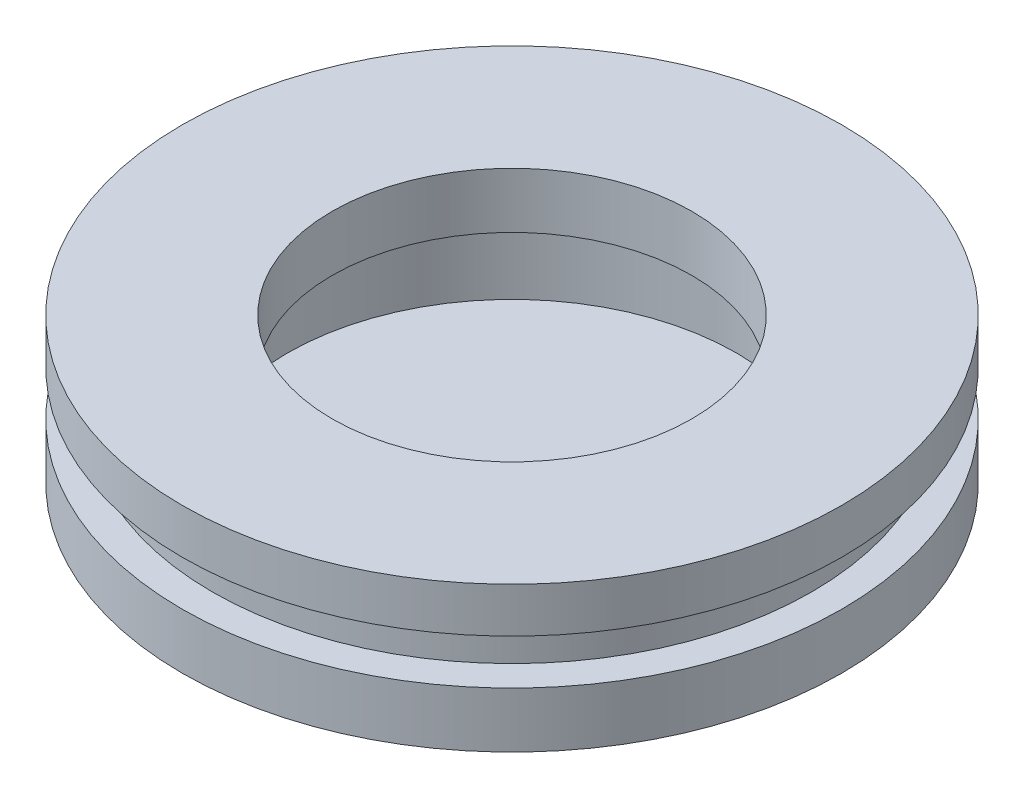
ISO-10303-21;
HEADER;
FILE_DESCRIPTION(('STEP AP214'),'2;1');
FILE_NAME('part.step','',(''),(''),'','','');
FILE_SCHEMA(('AUTOMOTIVE_DESIGN { 1 0 10303 214 1 1 1 1 }'));
ENDSEC;
DATA;
#1=APPLICATION_CONTEXT('core data for automotive mechanical design processes');
#2=APPLICATION_PROTOCOL_DEFINITION('international standard','automotive_design',2000,#1);
#3=PRODUCT_CONTEXT('',#1,'mechanical');
#4=PRODUCT('Part','Part','',(#3));
#5=PRODUCT_RELATED_PRODUCT_CATEGORY('part','',(#4));
#6=PRODUCT_DEFINITION_FORMATION('','',#4);
#7=PRODUCT_DEFINITION_CONTEXT('part definition',#1,'design');
#8=PRODUCT_DEFINITION('design','',#6,#7);
#9=PRODUCT_DEFINITION_SHAPE('','',#8);
#10=(LENGTH_UNIT() NAMED_UNIT(*) SI_UNIT(.MILLI.,.METRE.));
#11=(NAMED_UNIT(*) PLANE_ANGLE_UNIT() SI_UNIT($,.RADIAN.));
#12=(NAMED_UNIT(*) SI_UNIT($,.STERADIAN.) SOLID_ANGLE_UNIT());
#13=UNCERTAINTY_MEASURE_WITH_UNIT(LENGTH_MEASURE(1.E-05),#10,'distance_accuracy_value','');
#14=(GEOMETRIC_REPRESENTATION_CONTEXT(3) GLOBAL_UNCERTAINTY_ASSIGNED_CONTEXT((#13)) GLOBAL_UNIT_ASSIGNED_CONTEXT((#10,
#11,#12)) REPRESENTATION_CONTEXT('',''));
#15=CARTESIAN_POINT('',(0.,0.,0.));
#16=DIRECTION('',(0.,0.,1.));
#17=DIRECTION('',(1.,0.,0.));
#18=AXIS2_PLACEMENT_3D('',#15,#16,#17);
#19=CARTESIAN_POINT('',(0.,4.00367257692815,0.));
#20=DIRECTION('',(0.,1.,0.));
#21=DIRECTION('',(0.,0.,1.));
#22=AXIS2_PLACEMENT_3D('',#19,#20,#21);
#23=CONICAL_SURFACE('',#22,11.,1.22173047639604);
#24=CARTESIAN_POINT('',(0.,0.,0.));
#25=VERTEX_POINT('',#24);
#26=VERTEX_LOOP('',#25);
#27=FACE_BOUND('',#26,.T.);
#28=CARTESIAN_POINT('',(0.,4.00367257692815,0.));
#29=DIRECTION('',(0.,-1.,0.));
#30=DIRECTION('',(0.,0.,-1.));
#31=AXIS2_PLACEMENT_3D('',#28,#29,#30);
#32=CIRCLE('',#31,11.);
#33=CARTESIAN_POINT('',(0.,4.00367257692815,-11.));
#34=VERTEX_POINT('',#33);
#35=EDGE_CURVE('E47',#34,#34,#32,.T.);
#36=ORIENTED_EDGE('',*,*,#35,.T.);
#37=EDGE_LOOP('',(#36));
#38=FACE_BOUND('',#37,.T.);
#39=ADVANCED_FACE('F32',(#27,#38),#23,.T.);
#40=CARTESIAN_POINT('',(0.,8.85367257692815,0.));
#41=DIRECTION('',(0.,-1.,0.));
#42=DIRECTION('',(0.,0.,-1.));
#43=AXIS2_PLACEMENT_3D('',#40,#41,#42);
#44=PLANE('',#43);
#45=CARTESIAN_POINT('',(0.,8.85367257692815,0.));
#46=DIRECTION('',(0.,-1.,0.));
#47=DIRECTION('',(0.,0.,-1.));
#48=AXIS2_PLACEMENT_3D('',#45,#46,#47);
#49=CIRCLE('',#48,6.);
#50=CARTESIAN_POINT('',(0.,8.85367257692815,-6.));
#51=VERTEX_POINT('',#50);
#52=EDGE_CURVE('E35',#51,#51,#49,.F.);
#53=ORIENTED_EDGE('',*,*,#52,.F.);
#54=EDGE_LOOP('',(#53));
#55=FACE_BOUND('',#54,.T.);
#56=CARTESIAN_POINT('',(0.,8.85367257692815,0.));
#57=DIRECTION('',(0.,-1.,0.));
#58=DIRECTION('',(0.,0.,-1.));
#59=AXIS2_PLACEMENT_3D('',#56,#57,#58);
#60=CIRCLE('',#59,11.);
#61=CARTESIAN_POINT('',(0.,8.85367257692815,-11.));
#62=VERTEX_POINT('',#61);
#63=EDGE_CURVE('E11',#62,#62,#60,.T.);
#64=ORIENTED_EDGE('',*,*,#63,.F.);
#65=EDGE_LOOP('',(#64));
#66=FACE_BOUND('',#65,.T.);
#67=ADVANCED_FACE('F44',(#55,#66),#44,.F.);
#68=CARTESIAN_POINT('',(0.,0.,0.));
#69=DIRECTION('',(0.,-1.,0.));
#70=DIRECTION('',(0.,0.,-1.));
#71=AXIS2_PLACEMENT_3D('',#68,#69,#70);
#72=CYLINDRICAL_SURFACE('',#71,11.);
#73=CARTESIAN_POINT('',(0.,7.35367257692815,0.));
#74=DIRECTION('',(0.,-1.,0.));
#75=DIRECTION('',(0.,0.,-1.));
#76=AXIS2_PLACEMENT_3D('',#73,#74,#75);
#77=CIRCLE('',#76,11.);
#78=CARTESIAN_POINT('',(0.,7.35367257692815,-11.));
#79=VERTEX_POINT('',#78);
#80=EDGE_CURVE('E39',#79,#79,#77,.T.);
#81=ORIENTED_EDGE('',*,*,#80,.F.);
#82=EDGE_LOOP('',(#81));
#83=FACE_BOUND('',#82,.T.);
#84=ORIENTED_EDGE('',*,*,#63,.T.);
#85=EDGE_LOOP('',(#84));
#86=FACE_BOUND('',#85,.T.);
#87=ADVANCED_FACE('F69',(#83,#86),#72,.T.);
#88=CARTESIAN_POINT('',(-11.,7.35367257692815,0.));
#89=DIRECTION('',(0.,1.,0.));
#90=DIRECTION('',(0.,0.,1.));
#91=AXIS2_PLACEMENT_3D('',#88,#89,#90);
#92=PLANE('',#91);
#93=CARTESIAN_POINT('',(0.,7.35367257692815,0.));
#94=DIRECTION('',(0.,-1.,0.));
#95=DIRECTION('',(0.,0.,-1.));
#96=AXIS2_PLACEMENT_3D('',#93,#94,#95);
#97=CIRCLE('',#96,10.);
#98=CARTESIAN_POINT('',(0.,7.35367257692815,-10.));
#99=VERTEX_POINT('',#98);
#100=EDGE_CURVE('E61',#99,#99,#97,.T.);
#101=ORIENTED_EDGE('',*,*,#100,.F.);
#102=EDGE_LOOP('',(#101));
#103=FACE_BOUND('',#102,.T.);
#104=ORIENTED_EDGE('',*,*,#80,.T.);
#105=EDGE_LOOP('',(#104));
#106=FACE_BOUND('',#105,.T.);
#107=ADVANCED_FACE('F67',(#103,#106),#92,.F.);
#108=CARTESIAN_POINT('',(0.,0.,0.));
#109=DIRECTION('',(0.,-1.,0.));
#110=DIRECTION('',(0.,0.,-1.));
#111=AXIS2_PLACEMENT_3D('',#108,#109,#110);
#112=CYLINDRICAL_SURFACE('',#111,10.);
#113=CARTESIAN_POINT('',(0.,5.85367257692815,0.));
#114=DIRECTION('',(0.,-1.,0.));
#115=DIRECTION('',(0.,0.,-1.));
#116=AXIS2_PLACEMENT_3D('',#113,#114,#115);
#117=CIRCLE('',#116,10.);
#118=CARTESIAN_POINT('',(0.,5.85367257692815,-10.));
#119=VERTEX_POINT('',#118);
#120=EDGE_CURVE('E52',#119,#119,#117,.T.);
#121=ORIENTED_EDGE('',*,*,#120,.F.);
#122=EDGE_LOOP('',(#121));
#123=FACE_BOUND('',#122,.T.);
#124=ORIENTED_EDGE('',*,*,#100,.T.);
#125=EDGE_LOOP('',(#124));
#126=FACE_BOUND('',#125,.T.);
#127=ADVANCED_FACE('F83',(#123,#126),#112,.T.);
#128=CARTESIAN_POINT('',(-10.,5.85367257692815,0.));
#129=DIRECTION('',(0.,-1.,0.));
#130=DIRECTION('',(0.,0.,-1.));
#131=AXIS2_PLACEMENT_3D('',#128,#129,#130);
#132=PLANE('',#131);
#133=CARTESIAN_POINT('',(0.,5.85367257692815,0.));
#134=DIRECTION('',(0.,-1.,0.));
#135=DIRECTION('',(0.,0.,-1.));
#136=AXIS2_PLACEMENT_3D('',#133,#134,#135);
#137=CIRCLE('',#136,11.);
#138=CARTESIAN_POINT('',(0.,5.85367257692815,-11.));
#139=VERTEX_POINT('',#138);
#140=EDGE_CURVE('E49',#139,#139,#137,.T.);
#141=ORIENTED_EDGE('',*,*,#140,.F.);
#142=EDGE_LOOP('',(#141));
#143=FACE_BOUND('',#142,.T.);
#144=ORIENTED_EDGE('',*,*,#120,.T.);
#145=EDGE_LOOP('',(#144));
#146=FACE_BOUND('',#145,.T.);
#147=ADVANCED_FACE('F87',(#143,#146),#132,.F.);
#148=CARTESIAN_POINT('',(0.,0.,0.));
#149=DIRECTION('',(0.,-1.,0.));
#150=DIRECTION('',(0.,0.,-1.));
#151=AXIS2_PLACEMENT_3D('',#148,#149,#150);
#152=CYLINDRICAL_SURFACE('',#151,11.);
#153=ORIENTED_EDGE('',*,*,#35,.F.);
#154=EDGE_LOOP('',(#153));
#155=FACE_BOUND('',#154,.T.);
#156=ORIENTED_EDGE('',*,*,#140,.T.);
#157=EDGE_LOOP('',(#156));
#158=FACE_BOUND('',#157,.T.);
#159=ADVANCED_FACE('F91',(#155,#158),#152,.T.);
#160=CARTESIAN_POINT('',(0.,0.,0.));
#161=DIRECTION('',(0.,-1.,0.));
#162=DIRECTION('',(0.,0.,-1.));
#163=AXIS2_PLACEMENT_3D('',#160,#161,#162);
#164=CYLINDRICAL_SURFACE('',#163,6.);
#165=CARTESIAN_POINT('',(0.,7.,0.));
#166=DIRECTION('',(0.,-1.,0.));
#167=DIRECTION('',(0.,0.,-1.));
#168=AXIS2_PLACEMENT_3D('',#165,#166,#167);
#169=CIRCLE('',#168,6.);
#170=CARTESIAN_POINT('',(0.,7.,-6.));
#171=VERTEX_POINT('',#170);
#172=EDGE_CURVE('E115',#171,#171,#169,.T.);
#173=ORIENTED_EDGE('',*,*,#172,.T.);
#174=EDGE_LOOP('',(#173));
#175=FACE_BOUND('',#174,.T.);
#176=ORIENTED_EDGE('',*,*,#52,.T.);
#177=EDGE_LOOP('',(#176));
#178=FACE_BOUND('',#177,.T.);
#179=ADVANCED_FACE('F95',(#175,#178),#164,.F.);
#180=CARTESIAN_POINT('',(-7.5,4.00367257692815,0.));
#181=DIRECTION('',(0.,1.,0.));
#182=DIRECTION('',(0.,0.,1.));
#183=AXIS2_PLACEMENT_3D('',#180,#181,#182);
#184=PLANE('',#183);
#185=CARTESIAN_POINT('',(0.,4.00367257692815,0.));
#186=DIRECTION('',(0.,-1.,0.));
#187=DIRECTION('',(0.,0.,-1.));
#188=AXIS2_PLACEMENT_3D('',#185,#186,#187);
#189=CIRCLE('',#188,7.5);
#190=CARTESIAN_POINT('',(0.,4.00367257692815,-7.5));
#191=VERTEX_POINT('',#190);
#192=EDGE_CURVE('E55',#191,#191,#189,.T.);
#193=ORIENTED_EDGE('',*,*,#192,.F.);
#194=EDGE_LOOP('',(#193));
#195=FACE_BOUND('',#194,.T.);
#196=ADVANCED_FACE('F96',(#195),#184,.T.);
#197=CARTESIAN_POINT('',(0.,0.,0.));
#198=DIRECTION('',(0.,-1.,0.));
#199=DIRECTION('',(0.,0.,-1.));
#200=AXIS2_PLACEMENT_3D('',#197,#198,#199);
#201=CYLINDRICAL_SURFACE('',#200,7.5);
#202=ORIENTED_EDGE('',*,*,#192,.T.);
#203=EDGE_LOOP('',(#202));
#204=FACE_BOUND('',#203,.T.);
#205=CARTESIAN_POINT('',(0.,7.,0.));
#206=DIRECTION('',(0.,-1.,0.));
#207=DIRECTION('',(0.,0.,-1.));
#208=AXIS2_PLACEMENT_3D('',#205,#206,#207);
#209=CIRCLE('',#208,7.5);
#210=CARTESIAN_POINT('',(0.,7.,-7.5));
#211=VERTEX_POINT('',#210);
#212=EDGE_CURVE('E117',#211,#211,#209,.T.);
#213=ORIENTED_EDGE('',*,*,#212,.F.);
#214=EDGE_LOOP('',(#213));
#215=FACE_BOUND('',#214,.T.);
#216=ADVANCED_FACE('F99',(#204,#215),#201,.F.);
#217=CARTESIAN_POINT('',(-6.,7.,0.));
#218=DIRECTION('',(0.,-1.,0.));
#219=DIRECTION('',(0.,0.,-1.));
#220=AXIS2_PLACEMENT_3D('',#217,#218,#219);
#221=PLANE('',#220);
#222=ORIENTED_EDGE('',*,*,#212,.T.);
#223=EDGE_LOOP('',(#222));
#224=FACE_BOUND('',#223,.T.);
#225=ORIENTED_EDGE('',*,*,#172,.F.);
#226=EDGE_LOOP('',(#225));
#227=FACE_BOUND('',#226,.T.);
#228=ADVANCED_FACE('F103',(#224,#227),#221,.T.);
#229=CLOSED_SHELL('',(#39,#67,#87,#107,#127,#147,#159,#179,#196,#216,#228));
#230=MANIFOLD_SOLID_BREP('B2',#229);
#231=ADVANCED_BREP_SHAPE_REPRESENTATION('',(#18,#230),#14);
#232=SHAPE_DEFINITION_REPRESENTATION(#9,#231);
ENDSEC;
END-ISO-10303-21;
